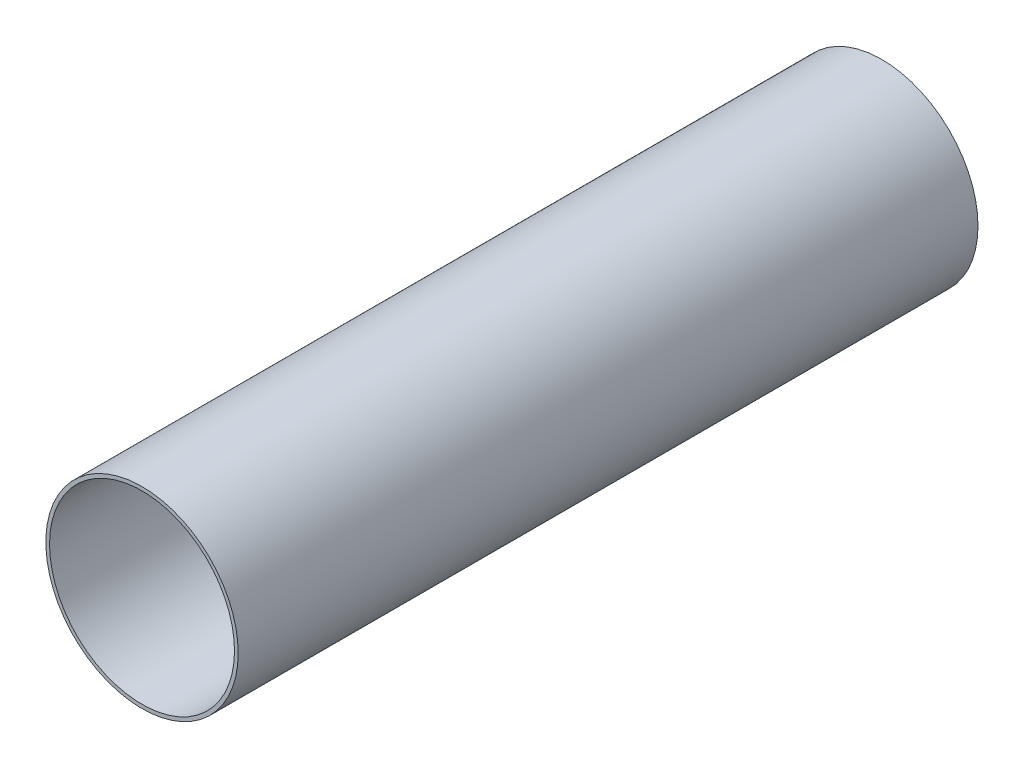
ISO-10303-21;
HEADER;
FILE_DESCRIPTION(('STEP AP214'),'2;1');
FILE_NAME('part.step','',(''),(''),'','','');
FILE_SCHEMA(('AUTOMOTIVE_DESIGN { 1 0 10303 214 1 1 1 1 }'));
ENDSEC;
DATA;
#1=APPLICATION_CONTEXT('core data for automotive mechanical design processes');
#2=APPLICATION_PROTOCOL_DEFINITION('international standard','automotive_design',2000,#1);
#3=PRODUCT_CONTEXT('',#1,'mechanical');
#4=PRODUCT('Part','Part','',(#3));
#5=PRODUCT_RELATED_PRODUCT_CATEGORY('part','',(#4));
#6=PRODUCT_DEFINITION_FORMATION('','',#4);
#7=PRODUCT_DEFINITION_CONTEXT('part definition',#1,'design');
#8=PRODUCT_DEFINITION('design','',#6,#7);
#9=PRODUCT_DEFINITION_SHAPE('','',#8);
#10=(LENGTH_UNIT() NAMED_UNIT(*) SI_UNIT(.MILLI.,.METRE.));
#11=(NAMED_UNIT(*) PLANE_ANGLE_UNIT() SI_UNIT($,.RADIAN.));
#12=(NAMED_UNIT(*) SI_UNIT($,.STERADIAN.) SOLID_ANGLE_UNIT());
#13=UNCERTAINTY_MEASURE_WITH_UNIT(LENGTH_MEASURE(1.E-05),#10,'distance_accuracy_value','');
#14=(GEOMETRIC_REPRESENTATION_CONTEXT(3) GLOBAL_UNCERTAINTY_ASSIGNED_CONTEXT((#13)) GLOBAL_UNIT_ASSIGNED_CONTEXT((#10,
#11,#12)) REPRESENTATION_CONTEXT('',''));
#15=CARTESIAN_POINT('',(0.,0.,0.));
#16=DIRECTION('',(0.,0.,1.));
#17=DIRECTION('',(1.,0.,0.));
#18=AXIS2_PLACEMENT_3D('',#15,#16,#17);
#19=CARTESIAN_POINT('',(0.,0.,200.));
#20=DIRECTION('',(0.,0.,1.));
#21=DIRECTION('',(1.,0.,0.));
#22=AXIS2_PLACEMENT_3D('',#19,#20,#21);
#23=PLANE('',#22);
#24=CARTESIAN_POINT('',(0.,0.,200.));
#25=DIRECTION('',(0.,0.,1.));
#26=DIRECTION('',(1.,0.,0.));
#27=AXIS2_PLACEMENT_3D('',#24,#25,#26);
#28=CIRCLE('',#27,26.);
#29=CARTESIAN_POINT('',(26.,0.,200.));
#30=VERTEX_POINT('',#29);
#31=EDGE_CURVE('E10',#30,#30,#28,.T.);
#32=ORIENTED_EDGE('',*,*,#31,.T.);
#33=EDGE_LOOP('',(#32));
#34=FACE_BOUND('',#33,.T.);
#35=CARTESIAN_POINT('',(0.,0.,200.));
#36=DIRECTION('',(0.,0.,1.));
#37=DIRECTION('',(1.,0.,0.));
#38=AXIS2_PLACEMENT_3D('',#35,#36,#37);
#39=CIRCLE('',#38,25.);
#40=CARTESIAN_POINT('',(25.,0.,200.));
#41=VERTEX_POINT('',#40);
#42=EDGE_CURVE('E42',#41,#41,#39,.T.);
#43=ORIENTED_EDGE('',*,*,#42,.F.);
#44=EDGE_LOOP('',(#43));
#45=FACE_BOUND('',#44,.T.);
#46=ADVANCED_FACE('F31',(#34,#45),#23,.T.);
#47=CARTESIAN_POINT('',(0.,0.,0.));
#48=DIRECTION('',(0.,0.,1.));
#49=DIRECTION('',(1.,0.,0.));
#50=AXIS2_PLACEMENT_3D('',#47,#48,#49);
#51=PLANE('',#50);
#52=CARTESIAN_POINT('',(0.,0.,0.));
#53=DIRECTION('',(0.,0.,1.));
#54=DIRECTION('',(1.,0.,0.));
#55=AXIS2_PLACEMENT_3D('',#52,#53,#54);
#56=CIRCLE('',#55,26.);
#57=CARTESIAN_POINT('',(26.,0.,0.));
#58=VERTEX_POINT('',#57);
#59=EDGE_CURVE('E35',#58,#58,#56,.T.);
#60=ORIENTED_EDGE('',*,*,#59,.F.);
#61=EDGE_LOOP('',(#60));
#62=FACE_BOUND('',#61,.T.);
#63=CARTESIAN_POINT('',(0.,0.,0.));
#64=DIRECTION('',(0.,0.,1.));
#65=DIRECTION('',(1.,0.,0.));
#66=AXIS2_PLACEMENT_3D('',#63,#64,#65);
#67=CIRCLE('',#66,25.);
#68=CARTESIAN_POINT('',(25.,0.,0.));
#69=VERTEX_POINT('',#68);
#70=EDGE_CURVE('E44',#69,#69,#67,.T.);
#71=ORIENTED_EDGE('',*,*,#70,.T.);
#72=EDGE_LOOP('',(#71));
#73=FACE_BOUND('',#72,.T.);
#74=ADVANCED_FACE('F54',(#62,#73),#51,.F.);
#75=CARTESIAN_POINT('',(0.,0.,200.));
#76=DIRECTION('',(0.,0.,-1.));
#77=DIRECTION('',(-1.,0.,0.));
#78=AXIS2_PLACEMENT_3D('',#75,#76,#77);
#79=CYLINDRICAL_SURFACE('',#78,26.);
#80=ORIENTED_EDGE('',*,*,#31,.F.);
#81=EDGE_LOOP('',(#80));
#82=FACE_BOUND('',#81,.T.);
#83=ORIENTED_EDGE('',*,*,#59,.T.);
#84=EDGE_LOOP('',(#83));
#85=FACE_BOUND('',#84,.T.);
#86=ADVANCED_FACE('F33',(#82,#85),#79,.T.);
#87=CARTESIAN_POINT('',(0.,0.,200.));
#88=DIRECTION('',(0.,0.,-1.));
#89=DIRECTION('',(-1.,0.,0.));
#90=AXIS2_PLACEMENT_3D('',#87,#88,#89);
#91=CYLINDRICAL_SURFACE('',#90,25.);
#92=ORIENTED_EDGE('',*,*,#42,.T.);
#93=EDGE_LOOP('',(#92));
#94=FACE_BOUND('',#93,.T.);
#95=ORIENTED_EDGE('',*,*,#70,.F.);
#96=EDGE_LOOP('',(#95));
#97=FACE_BOUND('',#96,.T.);
#98=ADVANCED_FACE('F50',(#94,#97),#91,.F.);
#99=CLOSED_SHELL('',(#46,#74,#86,#98));
#100=MANIFOLD_SOLID_BREP('B2',#99);
#101=ADVANCED_BREP_SHAPE_REPRESENTATION('',(#18,#100),#14);
#102=SHAPE_DEFINITION_REPRESENTATION(#9,#101);
ENDSEC;
END-ISO-10303-21;
